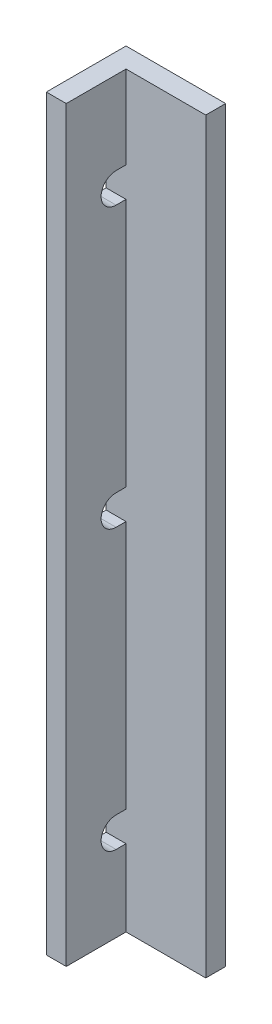
ISO-10303-21;
HEADER;
FILE_DESCRIPTION(('STEP AP214'),'2;1');
FILE_NAME('part.step','',(''),(''),'','','');
FILE_SCHEMA(('AUTOMOTIVE_DESIGN { 1 0 10303 214 1 1 1 1 }'));
ENDSEC;
DATA;
#1=APPLICATION_CONTEXT('core data for automotive mechanical design processes');
#2=APPLICATION_PROTOCOL_DEFINITION('international standard','automotive_design',2000,#1);
#3=PRODUCT_CONTEXT('',#1,'mechanical');
#4=PRODUCT('Part','Part','',(#3));
#5=PRODUCT_RELATED_PRODUCT_CATEGORY('part','',(#4));
#6=PRODUCT_DEFINITION_FORMATION('','',#4);
#7=PRODUCT_DEFINITION_CONTEXT('part definition',#1,'design');
#8=PRODUCT_DEFINITION('design','',#6,#7);
#9=PRODUCT_DEFINITION_SHAPE('','',#8);
#10=(LENGTH_UNIT() NAMED_UNIT(*) SI_UNIT(.MILLI.,.METRE.));
#11=(NAMED_UNIT(*) PLANE_ANGLE_UNIT() SI_UNIT($,.RADIAN.));
#12=(NAMED_UNIT(*) SI_UNIT($,.STERADIAN.) SOLID_ANGLE_UNIT());
#13=UNCERTAINTY_MEASURE_WITH_UNIT(LENGTH_MEASURE(1.E-05),#10,'distance_accuracy_value','');
#14=(GEOMETRIC_REPRESENTATION_CONTEXT(3) GLOBAL_UNCERTAINTY_ASSIGNED_CONTEXT((#13)) GLOBAL_UNIT_ASSIGNED_CONTEXT((#10,
#11,#12)) REPRESENTATION_CONTEXT('',''));
#15=CARTESIAN_POINT('',(0.,0.,0.));
#16=DIRECTION('',(0.,0.,1.));
#17=DIRECTION('',(1.,0.,0.));
#18=AXIS2_PLACEMENT_3D('',#15,#16,#17);
#19=CARTESIAN_POINT('',(0.,75.,0.));
#20=DIRECTION('',(-1.,0.,0.));
#21=DIRECTION('',(0.,0.,1.));
#22=AXIS2_PLACEMENT_3D('',#19,#20,#21);
#23=PLANE('',#22);
#24=DIRECTION('',(0.,-1.,0.));
#25=VECTOR('',#24,1.);
#26=CARTESIAN_POINT('',(0.,75.,-6.));
#27=LINE('',#26,#25);
#28=CARTESIAN_POINT('',(0.,66.6727889657975,-6.));
#29=VERTEX_POINT('',#28);
#30=CARTESIAN_POINT('',(0.,63.6727889657975,-6.));
#31=VERTEX_POINT('',#30);
#32=EDGE_CURVE('E252',#29,#31,#27,.T.);
#33=ORIENTED_EDGE('',*,*,#32,.F.);
#34=DIRECTION('',(0.,0.,-1.));
#35=VECTOR('',#34,1.);
#36=CARTESIAN_POINT('',(0.,66.6727889657975,0.));
#37=LINE('',#36,#35);
#38=CARTESIAN_POINT('',(0.,66.6727889657975,-5.));
#39=VERTEX_POINT('',#38);
#40=EDGE_CURVE('E270',#39,#29,#37,.T.);
#41=ORIENTED_EDGE('',*,*,#40,.F.);
#42=CARTESIAN_POINT('',(0.,65.1727889657975,-5.));
#43=DIRECTION('',(-1.,0.,0.));
#44=DIRECTION('',(0.,0.,1.));
#45=AXIS2_PLACEMENT_3D('',#42,#43,#44);
#46=CIRCLE('',#45,1.5);
#47=CARTESIAN_POINT('',(0.,63.6727889657975,-5.));
#48=VERTEX_POINT('',#47);
#49=EDGE_CURVE('E261',#48,#39,#46,.T.);
#50=ORIENTED_EDGE('',*,*,#49,.F.);
#51=DIRECTION('',(0.,0.,1.));
#52=VECTOR('',#51,1.);
#53=CARTESIAN_POINT('',(0.,63.6727889657975,0.));
#54=LINE('',#53,#52);
#55=EDGE_CURVE('E266',#31,#48,#54,.T.);
#56=ORIENTED_EDGE('',*,*,#55,.F.);
#57=EDGE_LOOP('',(#33,#41,#50,#56));
#58=FACE_BOUND('',#57,.T.);
#59=DIRECTION('',(0.,-1.,0.));
#60=VECTOR('',#59,1.);
#61=CARTESIAN_POINT('',(0.,75.,-5.99999999999994));
#62=LINE('',#61,#60);
#63=CARTESIAN_POINT('',(0.,10.6727889657975,-6.00000000000001));
#64=VERTEX_POINT('',#63);
#65=CARTESIAN_POINT('',(0.,7.6727889657975,-6.00000000000002));
#66=VERTEX_POINT('',#65);
#67=EDGE_CURVE('E263',#64,#66,#62,.T.);
#68=ORIENTED_EDGE('',*,*,#67,.F.);
#69=DIRECTION('',(0.,0.,-1.));
#70=VECTOR('',#69,1.);
#71=CARTESIAN_POINT('',(0.,10.6727889657975,0.));
#72=LINE('',#71,#70);
#73=CARTESIAN_POINT('',(0.,10.6727889657975,-5.00000000000001));
#74=VERTEX_POINT('',#73);
#75=EDGE_CURVE('E162',#74,#64,#72,.T.);
#76=ORIENTED_EDGE('',*,*,#75,.F.);
#77=CARTESIAN_POINT('',(0.,9.1727889657975,-5.00000000000002));
#78=DIRECTION('',(-1.,0.,0.));
#79=DIRECTION('',(0.,0.,1.));
#80=AXIS2_PLACEMENT_3D('',#77,#78,#79);
#81=CIRCLE('',#80,1.5);
#82=CARTESIAN_POINT('',(0.,7.6727889657975,-5.00000000000002));
#83=VERTEX_POINT('',#82);
#84=EDGE_CURVE('E170',#83,#74,#81,.T.);
#85=ORIENTED_EDGE('',*,*,#84,.F.);
#86=DIRECTION('',(0.,0.,1.));
#87=VECTOR('',#86,1.);
#88=CARTESIAN_POINT('',(0.,7.6727889657975,0.));
#89=LINE('',#88,#87);
#90=EDGE_CURVE('E274',#66,#83,#89,.T.);
#91=ORIENTED_EDGE('',*,*,#90,.F.);
#92=EDGE_LOOP('',(#68,#76,#85,#91));
#93=FACE_BOUND('',#92,.T.);
#94=DIRECTION('',(0.,0.,1.));
#95=VECTOR('',#94,1.);
#96=CARTESIAN_POINT('',(0.,35.6727889657975,0.));
#97=LINE('',#96,#95);
#98=CARTESIAN_POINT('',(0.,35.6727889657975,-6.));
#99=VERTEX_POINT('',#98);
#100=CARTESIAN_POINT('',(0.,35.6727889657975,-5.));
#101=VERTEX_POINT('',#100);
#102=EDGE_CURVE('E238',#99,#101,#97,.T.);
#103=ORIENTED_EDGE('',*,*,#102,.F.);
#104=DIRECTION('',(0.,-1.,0.));
#105=VECTOR('',#104,1.);
#106=CARTESIAN_POINT('',(0.,75.,-6.));
#107=LINE('',#106,#105);
#108=CARTESIAN_POINT('',(0.,38.6727889657975,-6.));
#109=VERTEX_POINT('',#108);
#110=EDGE_CURVE('E236',#109,#99,#107,.T.);
#111=ORIENTED_EDGE('',*,*,#110,.F.);
#112=DIRECTION('',(0.,0.,-1.));
#113=VECTOR('',#112,1.);
#114=CARTESIAN_POINT('',(0.,38.6727889657975,0.));
#115=LINE('',#114,#113);
#116=CARTESIAN_POINT('',(0.,38.6727889657975,-5.));
#117=VERTEX_POINT('',#116);
#118=EDGE_CURVE('E243',#117,#109,#115,.T.);
#119=ORIENTED_EDGE('',*,*,#118,.F.);
#120=CARTESIAN_POINT('',(0.,37.1727889657975,-5.));
#121=DIRECTION('',(-1.,0.,0.));
#122=DIRECTION('',(0.,0.,1.));
#123=AXIS2_PLACEMENT_3D('',#120,#121,#122);
#124=CIRCLE('',#123,1.5);
#125=EDGE_CURVE('E218',#101,#117,#124,.T.);
#126=ORIENTED_EDGE('',*,*,#125,.F.);
#127=EDGE_LOOP('',(#103,#111,#119,#126));
#128=FACE_BOUND('',#127,.T.);
#129=DIRECTION('',(0.,0.,-1.));
#130=VECTOR('',#129,1.);
#131=CARTESIAN_POINT('',(0.,0.,0.));
#132=LINE('',#131,#130);
#133=CARTESIAN_POINT('',(0.,0.,0.));
#134=VERTEX_POINT('',#133);
#135=CARTESIAN_POINT('',(0.,0.,-8.));
#136=VERTEX_POINT('',#135);
#137=EDGE_CURVE('E215',#134,#136,#132,.T.);
#138=ORIENTED_EDGE('',*,*,#137,.F.);
#139=DIRECTION('',(0.,-1.,0.));
#140=VECTOR('',#139,1.);
#141=CARTESIAN_POINT('',(0.,75.,0.));
#142=LINE('',#141,#140);
#143=CARTESIAN_POINT('',(0.,75.,0.));
#144=VERTEX_POINT('',#143);
#145=EDGE_CURVE('E180',#144,#134,#142,.T.);
#146=ORIENTED_EDGE('',*,*,#145,.F.);
#147=DIRECTION('',(0.,0.,-1.));
#148=VECTOR('',#147,1.);
#149=CARTESIAN_POINT('',(0.,75.,0.));
#150=LINE('',#149,#148);
#151=CARTESIAN_POINT('',(0.,75.,-8.));
#152=VERTEX_POINT('',#151);
#153=EDGE_CURVE('E202',#144,#152,#150,.T.);
#154=ORIENTED_EDGE('',*,*,#153,.T.);
#155=DIRECTION('',(0.,-1.,0.));
#156=VECTOR('',#155,1.);
#157=CARTESIAN_POINT('',(0.,75.,-8.));
#158=LINE('',#157,#156);
#159=EDGE_CURVE('E183',#152,#136,#158,.T.);
#160=ORIENTED_EDGE('',*,*,#159,.T.);
#161=EDGE_LOOP('',(#138,#146,#154,#160));
#162=FACE_BOUND('',#161,.T.);
#163=ADVANCED_FACE('F33',(#58,#93,#128,#162),#23,.T.);
#164=CARTESIAN_POINT('',(2.,75.,0.));
#165=DIRECTION('',(0.,0.,1.));
#166=DIRECTION('',(1.,0.,0.));
#167=AXIS2_PLACEMENT_3D('',#164,#165,#166);
#168=PLANE('',#167);
#169=DIRECTION('',(-1.,0.,0.));
#170=VECTOR('',#169,1.);
#171=CARTESIAN_POINT('',(2.,0.,0.));
#172=LINE('',#171,#170);
#173=CARTESIAN_POINT('',(2.,0.,0.));
#174=VERTEX_POINT('',#173);
#175=EDGE_CURVE('E199',#174,#134,#172,.T.);
#176=ORIENTED_EDGE('',*,*,#175,.F.);
#177=DIRECTION('',(0.,-1.,0.));
#178=VECTOR('',#177,1.);
#179=CARTESIAN_POINT('',(2.,75.,0.));
#180=LINE('',#179,#178);
#181=CARTESIAN_POINT('',(2.,75.,0.));
#182=VERTEX_POINT('',#181);
#183=EDGE_CURVE('E194',#182,#174,#180,.T.);
#184=ORIENTED_EDGE('',*,*,#183,.F.);
#185=DIRECTION('',(-1.,0.,0.));
#186=VECTOR('',#185,1.);
#187=CARTESIAN_POINT('',(2.,75.,0.));
#188=LINE('',#187,#186);
#189=EDGE_CURVE('E186',#182,#144,#188,.T.);
#190=ORIENTED_EDGE('',*,*,#189,.T.);
#191=ORIENTED_EDGE('',*,*,#145,.T.);
#192=EDGE_LOOP('',(#176,#184,#190,#191));
#193=FACE_BOUND('',#192,.T.);
#194=ADVANCED_FACE('F338',(#193),#168,.T.);
#195=CARTESIAN_POINT('',(2.,75.,-6.));
#196=DIRECTION('',(1.,0.,0.));
#197=DIRECTION('',(0.,0.,-1.));
#198=AXIS2_PLACEMENT_3D('',#195,#196,#197);
#199=PLANE('',#198);
#200=DIRECTION('',(0.,0.,-1.));
#201=VECTOR('',#200,1.);
#202=CARTESIAN_POINT('',(2.,63.6727889657975,-6.));
#203=LINE('',#202,#201);
#204=CARTESIAN_POINT('',(2.,63.6727889657975,-5.));
#205=VERTEX_POINT('',#204);
#206=CARTESIAN_POINT('',(2.,63.6727889657975,-6.));
#207=VERTEX_POINT('',#206);
#208=EDGE_CURVE('E268',#205,#207,#203,.T.);
#209=ORIENTED_EDGE('',*,*,#208,.F.);
#210=CARTESIAN_POINT('',(2.,65.1727889657975,-5.));
#211=DIRECTION('',(1.,0.,0.));
#212=DIRECTION('',(0.,0.,-1.));
#213=AXIS2_PLACEMENT_3D('',#210,#211,#212);
#214=CIRCLE('',#213,1.5);
#215=CARTESIAN_POINT('',(2.,66.6727889657975,-5.));
#216=VERTEX_POINT('',#215);
#217=EDGE_CURVE('E11',#216,#205,#214,.T.);
#218=ORIENTED_EDGE('',*,*,#217,.F.);
#219=DIRECTION('',(0.,0.,1.));
#220=VECTOR('',#219,1.);
#221=CARTESIAN_POINT('',(2.,66.6727889657975,-6.));
#222=LINE('',#221,#220);
#223=CARTESIAN_POINT('',(2.,66.6727889657975,-6.));
#224=VERTEX_POINT('',#223);
#225=EDGE_CURVE('E272',#224,#216,#222,.T.);
#226=ORIENTED_EDGE('',*,*,#225,.F.);
#227=DIRECTION('',(0.,-1.,0.));
#228=VECTOR('',#227,1.);
#229=CARTESIAN_POINT('',(2.,75.,-6.));
#230=LINE('',#229,#228);
#231=CARTESIAN_POINT('',(2.,75.,-6.));
#232=VERTEX_POINT('',#231);
#233=EDGE_CURVE('E191',#232,#224,#230,.T.);
#234=ORIENTED_EDGE('',*,*,#233,.F.);
#235=DIRECTION('',(0.,0.,1.));
#236=VECTOR('',#235,1.);
#237=CARTESIAN_POINT('',(2.,75.,-6.));
#238=LINE('',#237,#236);
#239=EDGE_CURVE('E221',#232,#182,#238,.T.);
#240=ORIENTED_EDGE('',*,*,#239,.T.);
#241=ORIENTED_EDGE('',*,*,#183,.T.);
#242=DIRECTION('',(0.,0.,1.));
#243=VECTOR('',#242,1.);
#244=CARTESIAN_POINT('',(2.,0.,-6.));
#245=LINE('',#244,#243);
#246=CARTESIAN_POINT('',(2.,0.,-6.));
#247=VERTEX_POINT('',#246);
#248=EDGE_CURVE('E203',#247,#174,#245,.T.);
#249=ORIENTED_EDGE('',*,*,#248,.F.);
#250=CARTESIAN_POINT('',(2.,7.6727889657975,-6.00000000000002));
#251=VERTEX_POINT('',#250);
#252=EDGE_CURVE('E190',#251,#247,#230,.T.);
#253=ORIENTED_EDGE('',*,*,#252,.F.);
#254=DIRECTION('',(0.,0.,-1.));
#255=VECTOR('',#254,1.);
#256=CARTESIAN_POINT('',(2.,7.6727889657975,-6.));
#257=LINE('',#256,#255);
#258=CARTESIAN_POINT('',(2.,7.6727889657975,-5.00000000000002));
#259=VERTEX_POINT('',#258);
#260=EDGE_CURVE('E178',#259,#251,#257,.T.);
#261=ORIENTED_EDGE('',*,*,#260,.F.);
#262=CARTESIAN_POINT('',(2.,9.1727889657975,-5.00000000000002));
#263=DIRECTION('',(1.,0.,0.));
#264=DIRECTION('',(0.,0.,-1.));
#265=AXIS2_PLACEMENT_3D('',#262,#263,#264);
#266=CIRCLE('',#265,1.5);
#267=CARTESIAN_POINT('',(2.,10.6727889657975,-5.00000000000001));
#268=VERTEX_POINT('',#267);
#269=EDGE_CURVE('E40',#268,#259,#266,.T.);
#270=ORIENTED_EDGE('',*,*,#269,.F.);
#271=DIRECTION('',(0.,0.,1.));
#272=VECTOR('',#271,1.);
#273=CARTESIAN_POINT('',(2.,10.6727889657975,-6.));
#274=LINE('',#273,#272);
#275=CARTESIAN_POINT('',(2.,10.6727889657975,-6.));
#276=VERTEX_POINT('',#275);
#277=EDGE_CURVE('E154',#276,#268,#274,.T.);
#278=ORIENTED_EDGE('',*,*,#277,.F.);
#279=CARTESIAN_POINT('',(2.,35.6727889657975,-6.));
#280=VERTEX_POINT('',#279);
#281=EDGE_CURVE('E196',#280,#276,#230,.T.);
#282=ORIENTED_EDGE('',*,*,#281,.F.);
#283=DIRECTION('',(0.,0.,-1.));
#284=VECTOR('',#283,1.);
#285=CARTESIAN_POINT('',(2.,35.6727889657975,-6.));
#286=LINE('',#285,#284);
#287=CARTESIAN_POINT('',(2.,35.6727889657975,-5.));
#288=VERTEX_POINT('',#287);
#289=EDGE_CURVE('E240',#288,#280,#286,.T.);
#290=ORIENTED_EDGE('',*,*,#289,.F.);
#291=CARTESIAN_POINT('',(2.,37.1727889657975,-5.));
#292=DIRECTION('',(1.,0.,0.));
#293=DIRECTION('',(0.,0.,-1.));
#294=AXIS2_PLACEMENT_3D('',#291,#292,#293);
#295=CIRCLE('',#294,1.5);
#296=CARTESIAN_POINT('',(2.,38.6727889657975,-5.));
#297=VERTEX_POINT('',#296);
#298=EDGE_CURVE('E179',#297,#288,#295,.T.);
#299=ORIENTED_EDGE('',*,*,#298,.F.);
#300=DIRECTION('',(0.,0.,1.));
#301=VECTOR('',#300,1.);
#302=CARTESIAN_POINT('',(2.,38.6727889657975,-6.));
#303=LINE('',#302,#301);
#304=CARTESIAN_POINT('',(2.,38.6727889657975,-6.));
#305=VERTEX_POINT('',#304);
#306=EDGE_CURVE('E246',#305,#297,#303,.T.);
#307=ORIENTED_EDGE('',*,*,#306,.F.);
#308=EDGE_CURVE('E195',#207,#305,#230,.T.);
#309=ORIENTED_EDGE('',*,*,#308,.F.);
#310=EDGE_LOOP('',(#209,#218,#226,#234,#240,#241,#249,#253,#261,#270,#278,#282,#290,#299,#307,#309));
#311=FACE_BOUND('',#310,.T.);
#312=ADVANCED_FACE('F176',(#311),#199,.T.);
#313=CARTESIAN_POINT('',(10.,75.,-6.));
#314=DIRECTION('',(0.,0.,1.));
#315=DIRECTION('',(1.,0.,0.));
#316=AXIS2_PLACEMENT_3D('',#313,#314,#315);
#317=PLANE('',#316);
#318=ORIENTED_EDGE('',*,*,#233,.T.);
#319=DIRECTION('',(1.,0.,0.));
#320=VECTOR('',#319,1.);
#321=CARTESIAN_POINT('',(-1.,66.6727889657975,-6.));
#322=LINE('',#321,#320);
#323=EDGE_CURVE('E283',#29,#224,#322,.T.);
#324=ORIENTED_EDGE('',*,*,#323,.F.);
#325=ORIENTED_EDGE('',*,*,#32,.T.);
#326=DIRECTION('',(1.,0.,0.));
#327=VECTOR('',#326,1.);
#328=CARTESIAN_POINT('',(-1.,63.6727889657975,-6.));
#329=LINE('',#328,#327);
#330=EDGE_CURVE('E163',#31,#207,#329,.T.);
#331=ORIENTED_EDGE('',*,*,#330,.T.);
#332=ORIENTED_EDGE('',*,*,#308,.T.);
#333=DIRECTION('',(1.,0.,0.));
#334=VECTOR('',#333,1.);
#335=CARTESIAN_POINT('',(-1.,38.6727889657975,-6.));
#336=LINE('',#335,#334);
#337=EDGE_CURVE('E251',#109,#305,#336,.T.);
#338=ORIENTED_EDGE('',*,*,#337,.F.);
#339=ORIENTED_EDGE('',*,*,#110,.T.);
#340=DIRECTION('',(1.,0.,0.));
#341=VECTOR('',#340,1.);
#342=CARTESIAN_POINT('',(-1.,35.6727889657975,-6.));
#343=LINE('',#342,#341);
#344=EDGE_CURVE('E249',#99,#280,#343,.T.);
#345=ORIENTED_EDGE('',*,*,#344,.T.);
#346=ORIENTED_EDGE('',*,*,#281,.T.);
#347=DIRECTION('',(1.,0.,0.));
#348=VECTOR('',#347,1.);
#349=CARTESIAN_POINT('',(-1.,10.6727889657975,-6.00000000000001));
#350=LINE('',#349,#348);
#351=EDGE_CURVE('E157',#64,#276,#350,.T.);
#352=ORIENTED_EDGE('',*,*,#351,.F.);
#353=ORIENTED_EDGE('',*,*,#67,.T.);
#354=DIRECTION('',(1.,0.,0.));
#355=VECTOR('',#354,1.);
#356=CARTESIAN_POINT('',(-1.,7.6727889657975,-6.00000000000002));
#357=LINE('',#356,#355);
#358=EDGE_CURVE('E280',#66,#251,#357,.T.);
#359=ORIENTED_EDGE('',*,*,#358,.T.);
#360=ORIENTED_EDGE('',*,*,#252,.T.);
#361=DIRECTION('',(-1.,0.,0.));
#362=VECTOR('',#361,1.);
#363=CARTESIAN_POINT('',(10.,0.,-6.));
#364=LINE('',#363,#362);
#365=CARTESIAN_POINT('',(10.,0.,-6.));
#366=VERTEX_POINT('',#365);
#367=EDGE_CURVE('E206',#366,#247,#364,.T.);
#368=ORIENTED_EDGE('',*,*,#367,.F.);
#369=DIRECTION('',(0.,-1.,0.));
#370=VECTOR('',#369,1.);
#371=CARTESIAN_POINT('',(10.,75.,-6.));
#372=LINE('',#371,#370);
#373=CARTESIAN_POINT('',(10.,75.,-6.));
#374=VERTEX_POINT('',#373);
#375=EDGE_CURVE('E188',#374,#366,#372,.T.);
#376=ORIENTED_EDGE('',*,*,#375,.F.);
#377=DIRECTION('',(-1.,0.,0.));
#378=VECTOR('',#377,1.);
#379=CARTESIAN_POINT('',(10.,75.,-6.));
#380=LINE('',#379,#378);
#381=EDGE_CURVE('E224',#374,#232,#380,.T.);
#382=ORIENTED_EDGE('',*,*,#381,.T.);
#383=EDGE_LOOP('',(#318,#324,#325,#331,#332,#338,#339,#345,#346,#352,#353,#359,#360,#368,#376,#382));
#384=FACE_BOUND('',#383,.T.);
#385=ADVANCED_FACE('F293',(#384),#317,.T.);
#386=CARTESIAN_POINT('',(10.,75.,-8.));
#387=DIRECTION('',(1.,0.,0.));
#388=DIRECTION('',(0.,0.,-1.));
#389=AXIS2_PLACEMENT_3D('',#386,#387,#388);
#390=PLANE('',#389);
#391=DIRECTION('',(0.,0.,1.));
#392=VECTOR('',#391,1.);
#393=CARTESIAN_POINT('',(10.,0.,-8.));
#394=LINE('',#393,#392);
#395=CARTESIAN_POINT('',(10.,0.,-8.));
#396=VERTEX_POINT('',#395);
#397=EDGE_CURVE('E209',#396,#366,#394,.T.);
#398=ORIENTED_EDGE('',*,*,#397,.F.);
#399=DIRECTION('',(0.,-1.,0.));
#400=VECTOR('',#399,1.);
#401=CARTESIAN_POINT('',(10.,75.,-8.));
#402=LINE('',#401,#400);
#403=CARTESIAN_POINT('',(10.,75.,-8.));
#404=VERTEX_POINT('',#403);
#405=EDGE_CURVE('E185',#404,#396,#402,.T.);
#406=ORIENTED_EDGE('',*,*,#405,.F.);
#407=DIRECTION('',(0.,0.,1.));
#408=VECTOR('',#407,1.);
#409=CARTESIAN_POINT('',(10.,75.,-8.));
#410=LINE('',#409,#408);
#411=EDGE_CURVE('E227',#404,#374,#410,.T.);
#412=ORIENTED_EDGE('',*,*,#411,.T.);
#413=ORIENTED_EDGE('',*,*,#375,.T.);
#414=EDGE_LOOP('',(#398,#406,#412,#413));
#415=FACE_BOUND('',#414,.T.);
#416=ADVANCED_FACE('F310',(#415),#390,.T.);
#417=CARTESIAN_POINT('',(0.,75.,-8.));
#418=DIRECTION('',(0.,0.,-1.));
#419=DIRECTION('',(-1.,0.,0.));
#420=AXIS2_PLACEMENT_3D('',#417,#418,#419);
#421=PLANE('',#420);
#422=DIRECTION('',(1.,0.,0.));
#423=VECTOR('',#422,1.);
#424=CARTESIAN_POINT('',(0.,0.,-8.));
#425=LINE('',#424,#423);
#426=EDGE_CURVE('E212',#136,#396,#425,.T.);
#427=ORIENTED_EDGE('',*,*,#426,.F.);
#428=ORIENTED_EDGE('',*,*,#159,.F.);
#429=DIRECTION('',(1.,0.,0.));
#430=VECTOR('',#429,1.);
#431=CARTESIAN_POINT('',(0.,75.,-8.));
#432=LINE('',#431,#430);
#433=EDGE_CURVE('E230',#152,#404,#432,.T.);
#434=ORIENTED_EDGE('',*,*,#433,.T.);
#435=ORIENTED_EDGE('',*,*,#405,.T.);
#436=EDGE_LOOP('',(#427,#428,#434,#435));
#437=FACE_BOUND('',#436,.T.);
#438=ADVANCED_FACE('F354',(#437),#421,.T.);
#439=CARTESIAN_POINT('',(0.,75.,0.));
#440=DIRECTION('',(0.,-1.,0.));
#441=DIRECTION('',(0.,0.,-1.));
#442=AXIS2_PLACEMENT_3D('',#439,#440,#441);
#443=PLANE('',#442);
#444=ORIENTED_EDGE('',*,*,#153,.F.);
#445=ORIENTED_EDGE('',*,*,#189,.F.);
#446=ORIENTED_EDGE('',*,*,#239,.F.);
#447=ORIENTED_EDGE('',*,*,#381,.F.);
#448=ORIENTED_EDGE('',*,*,#411,.F.);
#449=ORIENTED_EDGE('',*,*,#433,.F.);
#450=EDGE_LOOP('',(#444,#445,#446,#447,#448,#449));
#451=FACE_BOUND('',#450,.T.);
#452=ADVANCED_FACE('F316',(#451),#443,.F.);
#453=CARTESIAN_POINT('',(0.,0.,0.));
#454=DIRECTION('',(0.,-1.,0.));
#455=DIRECTION('',(0.,0.,-1.));
#456=AXIS2_PLACEMENT_3D('',#453,#454,#455);
#457=PLANE('',#456);
#458=ORIENTED_EDGE('',*,*,#137,.T.);
#459=ORIENTED_EDGE('',*,*,#426,.T.);
#460=ORIENTED_EDGE('',*,*,#397,.T.);
#461=ORIENTED_EDGE('',*,*,#367,.T.);
#462=ORIENTED_EDGE('',*,*,#248,.T.);
#463=ORIENTED_EDGE('',*,*,#175,.T.);
#464=EDGE_LOOP('',(#458,#459,#460,#461,#462,#463));
#465=FACE_BOUND('',#464,.T.);
#466=ADVANCED_FACE('F306',(#465),#457,.T.);
#467=CARTESIAN_POINT('',(-1.,35.6727889657975,-6.));
#468=DIRECTION('',(0.,-1.,0.));
#469=DIRECTION('',(0.,0.,-1.));
#470=AXIS2_PLACEMENT_3D('',#467,#468,#469);
#471=PLANE('',#470);
#472=ORIENTED_EDGE('',*,*,#102,.T.);
#473=DIRECTION('',(1.,0.,0.));
#474=VECTOR('',#473,1.);
#475=CARTESIAN_POINT('',(-1.,35.6727889657975,-5.));
#476=LINE('',#475,#474);
#477=EDGE_CURVE('E248',#101,#288,#476,.T.);
#478=ORIENTED_EDGE('',*,*,#477,.T.);
#479=ORIENTED_EDGE('',*,*,#289,.T.);
#480=ORIENTED_EDGE('',*,*,#344,.F.);
#481=EDGE_LOOP('',(#472,#478,#479,#480));
#482=FACE_BOUND('',#481,.T.);
#483=ADVANCED_FACE('F365',(#482),#471,.F.);
#484=CARTESIAN_POINT('',(-1.,37.1727889657975,-5.));
#485=DIRECTION('',(1.,0.,0.));
#486=DIRECTION('',(0.,0.,-1.));
#487=AXIS2_PLACEMENT_3D('',#484,#485,#486);
#488=CYLINDRICAL_SURFACE('',#487,1.5);
#489=ORIENTED_EDGE('',*,*,#125,.T.);
#490=DIRECTION('',(1.,0.,0.));
#491=VECTOR('',#490,1.);
#492=CARTESIAN_POINT('',(-1.,38.6727889657975,-5.));
#493=LINE('',#492,#491);
#494=EDGE_CURVE('E255',#117,#297,#493,.T.);
#495=ORIENTED_EDGE('',*,*,#494,.T.);
#496=ORIENTED_EDGE('',*,*,#298,.T.);
#497=ORIENTED_EDGE('',*,*,#477,.F.);
#498=EDGE_LOOP('',(#489,#495,#496,#497));
#499=FACE_BOUND('',#498,.T.);
#500=ADVANCED_FACE('F369',(#499),#488,.F.);
#501=CARTESIAN_POINT('',(-1.,38.6727889657975,-6.));
#502=DIRECTION('',(0.,1.,0.));
#503=DIRECTION('',(0.,0.,1.));
#504=AXIS2_PLACEMENT_3D('',#501,#502,#503);
#505=PLANE('',#504);
#506=ORIENTED_EDGE('',*,*,#118,.T.);
#507=ORIENTED_EDGE('',*,*,#337,.T.);
#508=ORIENTED_EDGE('',*,*,#306,.T.);
#509=ORIENTED_EDGE('',*,*,#494,.F.);
#510=EDGE_LOOP('',(#506,#507,#508,#509));
#511=FACE_BOUND('',#510,.T.);
#512=ADVANCED_FACE('F371',(#511),#505,.F.);
#513=CARTESIAN_POINT('',(-1.,7.6727889657975,-6.00000000000002));
#514=DIRECTION('',(0.,-1.,0.));
#515=DIRECTION('',(0.,0.,-1.));
#516=AXIS2_PLACEMENT_3D('',#513,#514,#515);
#517=PLANE('',#516);
#518=ORIENTED_EDGE('',*,*,#90,.T.);
#519=DIRECTION('',(1.,0.,0.));
#520=VECTOR('',#519,1.);
#521=CARTESIAN_POINT('',(-1.,7.6727889657975,-5.00000000000002));
#522=LINE('',#521,#520);
#523=EDGE_CURVE('E172',#83,#259,#522,.T.);
#524=ORIENTED_EDGE('',*,*,#523,.T.);
#525=ORIENTED_EDGE('',*,*,#260,.T.);
#526=ORIENTED_EDGE('',*,*,#358,.F.);
#527=EDGE_LOOP('',(#518,#524,#525,#526));
#528=FACE_BOUND('',#527,.T.);
#529=ADVANCED_FACE('F374',(#528),#517,.F.);
#530=CARTESIAN_POINT('',(-1.,9.1727889657975,-5.00000000000002));
#531=DIRECTION('',(1.,0.,0.));
#532=DIRECTION('',(0.,0.,-1.));
#533=AXIS2_PLACEMENT_3D('',#530,#531,#532);
#534=CYLINDRICAL_SURFACE('',#533,1.5);
#535=ORIENTED_EDGE('',*,*,#84,.T.);
#536=DIRECTION('',(1.,0.,0.));
#537=VECTOR('',#536,1.);
#538=CARTESIAN_POINT('',(-1.,10.6727889657975,-5.00000000000001));
#539=LINE('',#538,#537);
#540=EDGE_CURVE('E55',#74,#268,#539,.T.);
#541=ORIENTED_EDGE('',*,*,#540,.T.);
#542=ORIENTED_EDGE('',*,*,#269,.T.);
#543=ORIENTED_EDGE('',*,*,#523,.F.);
#544=EDGE_LOOP('',(#535,#541,#542,#543));
#545=FACE_BOUND('',#544,.T.);
#546=ADVANCED_FACE('F166',(#545),#534,.F.);
#547=CARTESIAN_POINT('',(-1.,10.6727889657975,-6.00000000000001));
#548=DIRECTION('',(0.,1.,0.));
#549=DIRECTION('',(0.,0.,1.));
#550=AXIS2_PLACEMENT_3D('',#547,#548,#549);
#551=PLANE('',#550);
#552=ORIENTED_EDGE('',*,*,#75,.T.);
#553=ORIENTED_EDGE('',*,*,#351,.T.);
#554=ORIENTED_EDGE('',*,*,#277,.T.);
#555=ORIENTED_EDGE('',*,*,#540,.F.);
#556=EDGE_LOOP('',(#552,#553,#554,#555));
#557=FACE_BOUND('',#556,.T.);
#558=ADVANCED_FACE('F155',(#557),#551,.F.);
#559=CARTESIAN_POINT('',(-1.,63.6727889657975,-6.));
#560=DIRECTION('',(0.,-1.,0.));
#561=DIRECTION('',(0.,0.,-1.));
#562=AXIS2_PLACEMENT_3D('',#559,#560,#561);
#563=PLANE('',#562);
#564=ORIENTED_EDGE('',*,*,#55,.T.);
#565=DIRECTION('',(1.,0.,0.));
#566=VECTOR('',#565,1.);
#567=CARTESIAN_POINT('',(-1.,63.6727889657975,-5.));
#568=LINE('',#567,#566);
#569=EDGE_CURVE('E286',#48,#205,#568,.T.);
#570=ORIENTED_EDGE('',*,*,#569,.T.);
#571=ORIENTED_EDGE('',*,*,#208,.T.);
#572=ORIENTED_EDGE('',*,*,#330,.F.);
#573=EDGE_LOOP('',(#564,#570,#571,#572));
#574=FACE_BOUND('',#573,.T.);
#575=ADVANCED_FACE('F325',(#574),#563,.F.);
#576=CARTESIAN_POINT('',(-1.,65.1727889657975,-5.));
#577=DIRECTION('',(1.,0.,0.));
#578=DIRECTION('',(0.,0.,-1.));
#579=AXIS2_PLACEMENT_3D('',#576,#577,#578);
#580=CYLINDRICAL_SURFACE('',#579,1.5);
#581=ORIENTED_EDGE('',*,*,#49,.T.);
#582=DIRECTION('',(1.,0.,0.));
#583=VECTOR('',#582,1.);
#584=CARTESIAN_POINT('',(-1.,66.6727889657975,-5.));
#585=LINE('',#584,#583);
#586=EDGE_CURVE('E47',#39,#216,#585,.T.);
#587=ORIENTED_EDGE('',*,*,#586,.T.);
#588=ORIENTED_EDGE('',*,*,#217,.T.);
#589=ORIENTED_EDGE('',*,*,#569,.F.);
#590=EDGE_LOOP('',(#581,#587,#588,#589));
#591=FACE_BOUND('',#590,.T.);
#592=ADVANCED_FACE('F327',(#591),#580,.F.);
#593=CARTESIAN_POINT('',(-1.,66.6727889657975,-6.));
#594=DIRECTION('',(0.,1.,0.));
#595=DIRECTION('',(0.,0.,1.));
#596=AXIS2_PLACEMENT_3D('',#593,#594,#595);
#597=PLANE('',#596);
#598=ORIENTED_EDGE('',*,*,#40,.T.);
#599=ORIENTED_EDGE('',*,*,#323,.T.);
#600=ORIENTED_EDGE('',*,*,#225,.T.);
#601=ORIENTED_EDGE('',*,*,#586,.F.);
#602=EDGE_LOOP('',(#598,#599,#600,#601));
#603=FACE_BOUND('',#602,.T.);
#604=ADVANCED_FACE('F329',(#603),#597,.F.);
#605=CLOSED_SHELL('',(#163,#194,#312,#385,#416,#438,#452,#466,#483,#500,#512,#529,#546,#558,
#575,#592,#604));
#606=MANIFOLD_SOLID_BREP('B2',#605);
#607=ADVANCED_BREP_SHAPE_REPRESENTATION('',(#18,#606),#14);
#608=SHAPE_DEFINITION_REPRESENTATION(#9,#607);
ENDSEC;
END-ISO-10303-21;
